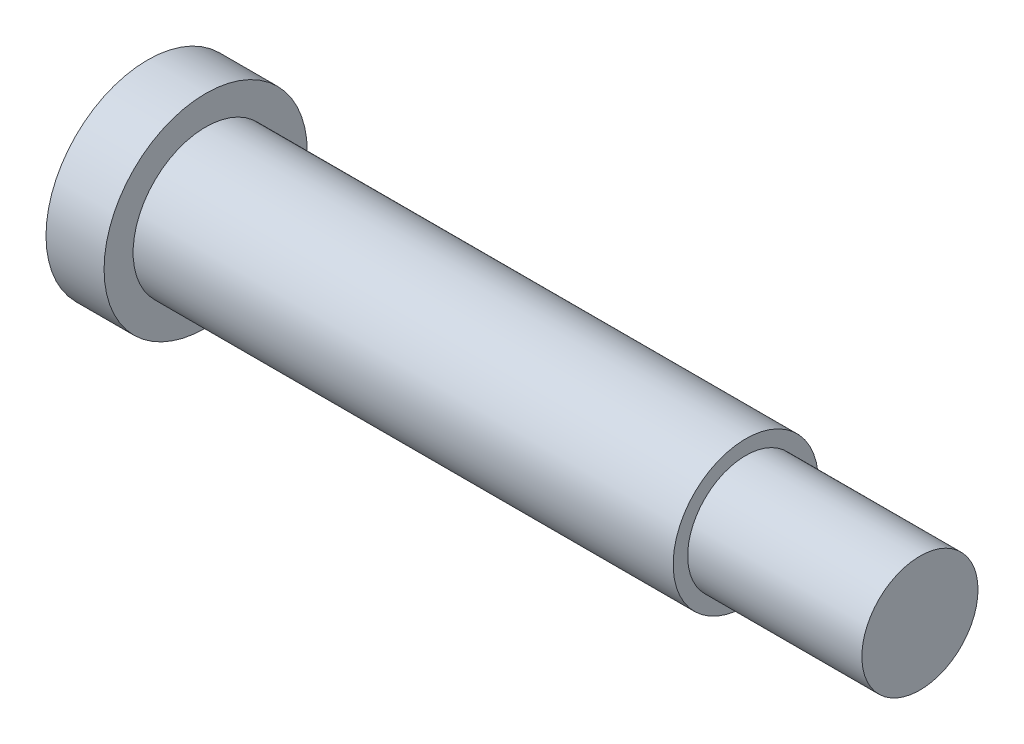
ISO-10303-21;
HEADER;
FILE_DESCRIPTION(('STEP AP214'),'2;1');
FILE_NAME('part.step','',(''),(''),'','','');
FILE_SCHEMA(('AUTOMOTIVE_DESIGN { 1 0 10303 214 1 1 1 1 }'));
ENDSEC;
DATA;
#1=APPLICATION_CONTEXT('core data for automotive mechanical design processes');
#2=APPLICATION_PROTOCOL_DEFINITION('international standard','automotive_design',2000,#1);
#3=PRODUCT_CONTEXT('',#1,'mechanical');
#4=PRODUCT('Part','Part','',(#3));
#5=PRODUCT_RELATED_PRODUCT_CATEGORY('part','',(#4));
#6=PRODUCT_DEFINITION_FORMATION('','',#4);
#7=PRODUCT_DEFINITION_CONTEXT('part definition',#1,'design');
#8=PRODUCT_DEFINITION('design','',#6,#7);
#9=PRODUCT_DEFINITION_SHAPE('','',#8);
#10=(LENGTH_UNIT() NAMED_UNIT(*) SI_UNIT(.MILLI.,.METRE.));
#11=(NAMED_UNIT(*) PLANE_ANGLE_UNIT() SI_UNIT($,.RADIAN.));
#12=(NAMED_UNIT(*) SI_UNIT($,.STERADIAN.) SOLID_ANGLE_UNIT());
#13=UNCERTAINTY_MEASURE_WITH_UNIT(LENGTH_MEASURE(1.E-05),#10,'distance_accuracy_value','');
#14=(GEOMETRIC_REPRESENTATION_CONTEXT(3) GLOBAL_UNCERTAINTY_ASSIGNED_CONTEXT((#13)) GLOBAL_UNIT_ASSIGNED_CONTEXT((#10,
#11,#12)) REPRESENTATION_CONTEXT('',''));
#15=CARTESIAN_POINT('',(0.,0.,0.));
#16=DIRECTION('',(0.,0.,1.));
#17=DIRECTION('',(1.,0.,0.));
#18=AXIS2_PLACEMENT_3D('',#15,#16,#17);
#19=CARTESIAN_POINT('',(3.0049,7.0049,7.0049));
#20=DIRECTION('',(1.,0.,0.));
#21=DIRECTION('',(0.,0.,-1.));
#22=AXIS2_PLACEMENT_3D('',#19,#20,#21);
#23=PLANE('',#22);
#24=DIRECTION('',(0.,1.,0.));
#25=VECTOR('',#24,1.);
#26=CARTESIAN_POINT('',(3.0049,8.159600538379,9.0049));
#27=LINE('',#26,#25);
#28=CARTESIAN_POINT('',(3.0049,8.15960053837884,9.00489999999991));
#29=VERTEX_POINT('',#28);
#30=CARTESIAN_POINT('',(3.0049,5.850199461621,9.0049));
#31=VERTEX_POINT('',#30);
#32=EDGE_CURVE('E84',#29,#31,#27,.F.);
#33=ORIENTED_EDGE('',*,*,#32,.F.);
#34=DIRECTION('',(0.,0.50000000000019,-0.866025403784329));
#35=VECTOR('',#34,1.);
#36=CARTESIAN_POINT('',(3.0049,9.314301076758,7.0049));
#37=LINE('',#36,#35);
#38=CARTESIAN_POINT('',(3.0049,9.31430107675878,7.00489999999991));
#39=VERTEX_POINT('',#38);
#40=EDGE_CURVE('E134',#39,#29,#37,.F.);
#41=ORIENTED_EDGE('',*,*,#40,.F.);
#42=DIRECTION('',(0.,-0.50000000000019,-0.866025403784329));
#43=VECTOR('',#42,1.);
#44=CARTESIAN_POINT('',(3.0049,8.159600538379,5.0049));
#45=LINE('',#44,#43);
#46=CARTESIAN_POINT('',(3.0049,8.159600538379,5.0049));
#47=VERTEX_POINT('',#46);
#48=EDGE_CURVE('E128',#47,#39,#45,.F.);
#49=ORIENTED_EDGE('',*,*,#48,.F.);
#50=DIRECTION('',(0.,-1.,0.));
#51=VECTOR('',#50,1.);
#52=CARTESIAN_POINT('',(3.0049,5.850199461621,5.0049));
#53=LINE('',#52,#51);
#54=CARTESIAN_POINT('',(3.0049,5.85019946162094,5.00489999999996));
#55=VERTEX_POINT('',#54);
#56=EDGE_CURVE('E73',#55,#47,#53,.F.);
#57=ORIENTED_EDGE('',*,*,#56,.F.);
#58=DIRECTION('',(0.,-0.50000000000019,0.866025403784329));
#59=VECTOR('',#58,1.);
#60=CARTESIAN_POINT('',(3.0049,4.695498923241,7.0049));
#61=LINE('',#60,#59);
#62=CARTESIAN_POINT('',(3.0049,4.69549892324103,7.00489999999998));
#63=VERTEX_POINT('',#62);
#64=EDGE_CURVE('E70',#63,#55,#61,.F.);
#65=ORIENTED_EDGE('',*,*,#64,.F.);
#66=DIRECTION('',(0.,0.50000000000019,0.866025403784329));
#67=VECTOR('',#66,1.);
#68=CARTESIAN_POINT('',(3.0049,5.850199461621,9.0049));
#69=LINE('',#68,#67);
#70=EDGE_CURVE('E67',#31,#63,#69,.F.);
#71=ORIENTED_EDGE('',*,*,#70,.F.);
#72=EDGE_LOOP('',(#33,#41,#49,#57,#65,#71));
#73=FACE_BOUND('',#72,.T.);
#74=ADVANCED_FACE('F16',(#73),#23,.F.);
#75=CARTESIAN_POINT('',(0.004899999999992,4.695498923241,7.0049));
#76=DIRECTION('',(0.,0.866025403784329,0.50000000000019));
#77=DIRECTION('',(0.,-0.50000000000019,0.866025403784329));
#78=AXIS2_PLACEMENT_3D('',#75,#76,#77);
#79=PLANE('',#78);
#80=DIRECTION('',(1.,0.,0.));
#81=VECTOR('',#80,1.);
#82=CARTESIAN_POINT('',(0.004899999999992,5.850199461621,5.0049));
#83=LINE('',#82,#81);
#84=CARTESIAN_POINT('',(0.0049000000000025,5.85019946162094,5.00489999999996));
#85=VERTEX_POINT('',#84);
#86=EDGE_CURVE('E124',#85,#55,#83,.T.);
#87=ORIENTED_EDGE('',*,*,#86,.F.);
#88=DIRECTION('',(0.,-0.500000000000243,0.866025403784298));
#89=VECTOR('',#88,1.);
#90=CARTESIAN_POINT('',(0.004899999999992,5.850199461621,5.0049));
#91=LINE('',#90,#89);
#92=CARTESIAN_POINT('',(0.0049000000000025,4.69549892324103,7.00489999999998));
#93=VERTEX_POINT('',#92);
#94=EDGE_CURVE('E81',#85,#93,#91,.T.);
#95=ORIENTED_EDGE('',*,*,#94,.T.);
#96=DIRECTION('',(1.,0.,0.));
#97=VECTOR('',#96,1.);
#98=CARTESIAN_POINT('',(0.004899999999992,4.69549892324112,7.00489999999993));
#99=LINE('',#98,#97);
#100=EDGE_CURVE('E78',#63,#93,#99,.F.);
#101=ORIENTED_EDGE('',*,*,#100,.F.);
#102=ORIENTED_EDGE('',*,*,#64,.T.);
#103=EDGE_LOOP('',(#87,#95,#101,#102));
#104=FACE_BOUND('',#103,.T.);
#105=ADVANCED_FACE('F79',(#104),#79,.T.);
#106=CARTESIAN_POINT('',(0.004899999999992,5.850199461621,9.0049));
#107=DIRECTION('',(0.,0.866025403784329,-0.50000000000019));
#108=DIRECTION('',(0.,0.50000000000019,0.866025403784329));
#109=AXIS2_PLACEMENT_3D('',#106,#107,#108);
#110=PLANE('',#109);
#111=ORIENTED_EDGE('',*,*,#100,.T.);
#112=DIRECTION('',(0.,0.500000000000243,0.866025403784298));
#113=VECTOR('',#112,1.);
#114=CARTESIAN_POINT('',(0.004899999999992,4.695498923241,7.0049));
#115=LINE('',#114,#113);
#116=CARTESIAN_POINT('',(0.0049000000000025,5.850199461621,9.0049));
#117=VERTEX_POINT('',#116);
#118=EDGE_CURVE('E118',#93,#117,#115,.T.);
#119=ORIENTED_EDGE('',*,*,#118,.T.);
#120=DIRECTION('',(1.,0.,0.));
#121=VECTOR('',#120,1.);
#122=CARTESIAN_POINT('',(0.004899999999992,5.850199461621,9.0049));
#123=LINE('',#122,#121);
#124=EDGE_CURVE('E88',#31,#117,#123,.F.);
#125=ORIENTED_EDGE('',*,*,#124,.F.);
#126=ORIENTED_EDGE('',*,*,#70,.T.);
#127=EDGE_LOOP('',(#111,#119,#125,#126));
#128=FACE_BOUND('',#127,.T.);
#129=ADVANCED_FACE('F86',(#128),#110,.T.);
#130=CARTESIAN_POINT('',(0.004899999999992,8.159600538379,9.0049));
#131=DIRECTION('',(0.,0.,-1.));
#132=DIRECTION('',(0.,1.,0.));
#133=AXIS2_PLACEMENT_3D('',#130,#131,#132);
#134=PLANE('',#133);
#135=ORIENTED_EDGE('',*,*,#124,.T.);
#136=DIRECTION('',(0.,1.,0.));
#137=VECTOR('',#136,1.);
#138=CARTESIAN_POINT('',(0.004899999999992,7.0049,9.0049));
#139=LINE('',#138,#137);
#140=CARTESIAN_POINT('',(0.0049000000000025,8.15960053837884,9.00489999999991));
#141=VERTEX_POINT('',#140);
#142=EDGE_CURVE('E116',#117,#141,#139,.T.);
#143=ORIENTED_EDGE('',*,*,#142,.T.);
#144=DIRECTION('',(1.,0.,0.));
#145=VECTOR('',#144,1.);
#146=CARTESIAN_POINT('',(0.004899999999992,8.15960053837837,9.00489999999964));
#147=LINE('',#146,#145);
#148=EDGE_CURVE('E131',#29,#141,#147,.F.);
#149=ORIENTED_EDGE('',*,*,#148,.F.);
#150=ORIENTED_EDGE('',*,*,#32,.T.);
#151=EDGE_LOOP('',(#135,#143,#149,#150));
#152=FACE_BOUND('',#151,.T.);
#153=ADVANCED_FACE('F139',(#152),#134,.T.);
#154=CARTESIAN_POINT('',(0.004899999999992,9.314301076758,7.0049));
#155=DIRECTION('',(0.,-0.866025403784329,-0.50000000000019));
#156=DIRECTION('',(0.,0.50000000000019,-0.866025403784329));
#157=AXIS2_PLACEMENT_3D('',#154,#155,#156);
#158=PLANE('',#157);
#159=ORIENTED_EDGE('',*,*,#148,.T.);
#160=DIRECTION('',(0.,0.500000000000243,-0.866025403784298));
#161=VECTOR('',#160,1.);
#162=CARTESIAN_POINT('',(0.004899999999992,8.159600538379,9.0049));
#163=LINE('',#162,#161);
#164=CARTESIAN_POINT('',(0.0049000000000025,9.31430107675859,7.0048999999998));
#165=VERTEX_POINT('',#164);
#166=EDGE_CURVE('E112',#141,#165,#163,.T.);
#167=ORIENTED_EDGE('',*,*,#166,.T.);
#168=DIRECTION('',(1.,0.,0.));
#169=VECTOR('',#168,1.);
#170=CARTESIAN_POINT('',(0.004899999999992,9.31430107675888,7.00490000000007));
#171=LINE('',#170,#169);
#172=EDGE_CURVE('E126',#39,#165,#171,.F.);
#173=ORIENTED_EDGE('',*,*,#172,.F.);
#174=ORIENTED_EDGE('',*,*,#40,.T.);
#175=EDGE_LOOP('',(#159,#167,#173,#174));
#176=FACE_BOUND('',#175,.T.);
#177=ADVANCED_FACE('F143',(#176),#158,.T.);
#178=CARTESIAN_POINT('',(0.004899999999992,8.159600538379,5.0049));
#179=DIRECTION('',(0.,-0.866025403784329,0.50000000000019));
#180=DIRECTION('',(0.,-0.50000000000019,-0.866025403784329));
#181=AXIS2_PLACEMENT_3D('',#178,#179,#180);
#182=PLANE('',#181);
#183=ORIENTED_EDGE('',*,*,#172,.T.);
#184=DIRECTION('',(0.,-0.500000000000243,-0.866025403784298));
#185=VECTOR('',#184,1.);
#186=CARTESIAN_POINT('',(0.004899999999992,9.314301076759,7.0049));
#187=LINE('',#186,#185);
#188=CARTESIAN_POINT('',(0.0049000000000025,8.159600538379,5.0049));
#189=VERTEX_POINT('',#188);
#190=EDGE_CURVE('E34',#165,#189,#187,.T.);
#191=ORIENTED_EDGE('',*,*,#190,.T.);
#192=DIRECTION('',(1.,0.,0.));
#193=VECTOR('',#192,1.);
#194=CARTESIAN_POINT('',(0.004899999999992,8.159600538379,5.0049));
#195=LINE('',#194,#193);
#196=EDGE_CURVE('E121',#47,#189,#195,.F.);
#197=ORIENTED_EDGE('',*,*,#196,.F.);
#198=ORIENTED_EDGE('',*,*,#48,.T.);
#199=EDGE_LOOP('',(#183,#191,#197,#198));
#200=FACE_BOUND('',#199,.T.);
#201=ADVANCED_FACE('F145',(#200),#182,.T.);
#202=CARTESIAN_POINT('',(0.004899999999992,5.850199461621,5.0049));
#203=DIRECTION('',(0.,0.,1.));
#204=DIRECTION('',(0.,-1.,0.));
#205=AXIS2_PLACEMENT_3D('',#202,#203,#204);
#206=PLANE('',#205);
#207=ORIENTED_EDGE('',*,*,#196,.T.);
#208=DIRECTION('',(0.,1.,0.));
#209=VECTOR('',#208,1.);
#210=CARTESIAN_POINT('',(0.004899999999992,7.0049,5.0049));
#211=LINE('',#210,#209);
#212=EDGE_CURVE('E105',#189,#85,#211,.F.);
#213=ORIENTED_EDGE('',*,*,#212,.T.);
#214=ORIENTED_EDGE('',*,*,#86,.T.);
#215=ORIENTED_EDGE('',*,*,#56,.T.);
#216=EDGE_LOOP('',(#207,#213,#214,#215));
#217=FACE_BOUND('',#216,.T.);
#218=ADVANCED_FACE('F146',(#217),#206,.T.);
#219=CARTESIAN_POINT('',(53.2049,7.0049,7.0049));
#220=DIRECTION('',(1.,0.,0.));
#221=DIRECTION('',(0.,0.,-1.));
#222=AXIS2_PLACEMENT_3D('',#219,#220,#221);
#223=PLANE('',#222);
#224=CARTESIAN_POINT('',(53.2049,7.0049,7.0049));
#225=DIRECTION('',(1.,0.,0.));
#226=DIRECTION('',(0.,0.,-1.));
#227=AXIS2_PLACEMENT_3D('',#224,#225,#226);
#228=CIRCLE('',#227,4.);
#229=CARTESIAN_POINT('',(53.2049,7.0049,3.0049));
#230=VERTEX_POINT('',#229);
#231=EDGE_CURVE('E19',#230,#230,#228,.F.);
#232=ORIENTED_EDGE('',*,*,#231,.F.);
#233=EDGE_LOOP('',(#232));
#234=FACE_BOUND('',#233,.T.);
#235=ADVANCED_FACE('F148',(#234),#223,.T.);
#236=CARTESIAN_POINT('',(0.004899999999992,7.0049,7.0049));
#237=DIRECTION('',(1.,0.,0.));
#238=DIRECTION('',(0.,0.,-1.));
#239=AXIS2_PLACEMENT_3D('',#236,#237,#238);
#240=PLANE('',#239);
#241=ORIENTED_EDGE('',*,*,#190,.F.);
#242=ORIENTED_EDGE('',*,*,#166,.F.);
#243=ORIENTED_EDGE('',*,*,#142,.F.);
#244=ORIENTED_EDGE('',*,*,#118,.F.);
#245=ORIENTED_EDGE('',*,*,#94,.F.);
#246=ORIENTED_EDGE('',*,*,#212,.F.);
#247=EDGE_LOOP('',(#241,#242,#243,#244,#245,#246));
#248=FACE_BOUND('',#247,.T.);
#249=CARTESIAN_POINT('',(0.004900000000006,7.0049,7.0049));
#250=DIRECTION('',(1.,0.,0.));
#251=DIRECTION('',(0.,0.,-1.));
#252=AXIS2_PLACEMENT_3D('',#249,#250,#251);
#253=CIRCLE('',#252,7.);
#254=CARTESIAN_POINT('',(0.004900000000006,7.0049,0.00490000000000039));
#255=VERTEX_POINT('',#254);
#256=EDGE_CURVE('E100',#255,#255,#253,.T.);
#257=ORIENTED_EDGE('',*,*,#256,.F.);
#258=EDGE_LOOP('',(#257));
#259=FACE_BOUND('',#258,.T.);
#260=ADVANCED_FACE('F155',(#248,#259),#240,.F.);
#261=CARTESIAN_POINT('',(41.2049,7.0049,7.0049));
#262=DIRECTION('',(1.,0.,0.));
#263=DIRECTION('',(0.,0.,-1.));
#264=AXIS2_PLACEMENT_3D('',#261,#262,#263);
#265=CYLINDRICAL_SURFACE('',#264,4.);
#266=CARTESIAN_POINT('',(41.2049,7.0049,7.0049));
#267=DIRECTION('',(1.,0.,0.));
#268=DIRECTION('',(0.,0.,-1.));
#269=AXIS2_PLACEMENT_3D('',#266,#267,#268);
#270=CIRCLE('',#269,4.);
#271=CARTESIAN_POINT('',(41.2049,7.0049,3.0049));
#272=VERTEX_POINT('',#271);
#273=EDGE_CURVE('E98',#272,#272,#270,.F.);
#274=ORIENTED_EDGE('',*,*,#273,.F.);
#275=EDGE_LOOP('',(#274));
#276=FACE_BOUND('',#275,.T.);
#277=ORIENTED_EDGE('',*,*,#231,.T.);
#278=EDGE_LOOP('',(#277));
#279=FACE_BOUND('',#278,.T.);
#280=ADVANCED_FACE('F178',(#276,#279),#265,.T.);
#281=CARTESIAN_POINT('',(0.004899999999992,7.0049,7.0049));
#282=DIRECTION('',(1.,0.,0.));
#283=DIRECTION('',(0.,0.,-1.));
#284=AXIS2_PLACEMENT_3D('',#281,#282,#283);
#285=CYLINDRICAL_SURFACE('',#284,7.);
#286=ORIENTED_EDGE('',*,*,#256,.T.);
#287=EDGE_LOOP('',(#286));
#288=FACE_BOUND('',#287,.T.);
#289=CARTESIAN_POINT('',(4.0049,7.0049,7.0049));
#290=DIRECTION('',(1.,0.,0.));
#291=DIRECTION('',(0.,0.,-1.));
#292=AXIS2_PLACEMENT_3D('',#289,#290,#291);
#293=CIRCLE('',#292,7.);
#294=CARTESIAN_POINT('',(4.0049,7.0049,0.00490000000000039));
#295=VERTEX_POINT('',#294);
#296=EDGE_CURVE('E95',#295,#295,#293,.T.);
#297=ORIENTED_EDGE('',*,*,#296,.F.);
#298=EDGE_LOOP('',(#297));
#299=FACE_BOUND('',#298,.T.);
#300=ADVANCED_FACE('F174',(#288,#299),#285,.T.);
#301=CARTESIAN_POINT('',(41.2049,7.0049,7.0049));
#302=DIRECTION('',(1.,0.,0.));
#303=DIRECTION('',(0.,0.,-1.));
#304=AXIS2_PLACEMENT_3D('',#301,#302,#303);
#305=PLANE('',#304);
#306=ORIENTED_EDGE('',*,*,#273,.T.);
#307=EDGE_LOOP('',(#306));
#308=FACE_BOUND('',#307,.T.);
#309=CARTESIAN_POINT('',(41.2049,7.0049,7.0049));
#310=DIRECTION('',(1.,0.,0.));
#311=DIRECTION('',(0.,0.,-1.));
#312=AXIS2_PLACEMENT_3D('',#309,#310,#311);
#313=CIRCLE('',#312,5.);
#314=CARTESIAN_POINT('',(41.2049,7.0049,2.0049));
#315=VERTEX_POINT('',#314);
#316=EDGE_CURVE('E25',#315,#315,#313,.F.);
#317=ORIENTED_EDGE('',*,*,#316,.F.);
#318=EDGE_LOOP('',(#317));
#319=FACE_BOUND('',#318,.T.);
#320=ADVANCED_FACE('F167',(#308,#319),#305,.T.);
#321=CARTESIAN_POINT('',(4.0049,7.0049,7.0049));
#322=DIRECTION('',(1.,0.,0.));
#323=DIRECTION('',(0.,0.,-1.));
#324=AXIS2_PLACEMENT_3D('',#321,#322,#323);
#325=PLANE('',#324);
#326=CARTESIAN_POINT('',(4.0049,7.0049,7.0049));
#327=DIRECTION('',(1.,0.,0.));
#328=DIRECTION('',(0.,0.,-1.));
#329=AXIS2_PLACEMENT_3D('',#326,#327,#328);
#330=CIRCLE('',#329,5.);
#331=CARTESIAN_POINT('',(4.0049,7.0049,2.0049));
#332=VERTEX_POINT('',#331);
#333=EDGE_CURVE('E11',#332,#332,#330,.T.);
#334=ORIENTED_EDGE('',*,*,#333,.F.);
#335=EDGE_LOOP('',(#334));
#336=FACE_BOUND('',#335,.T.);
#337=ORIENTED_EDGE('',*,*,#296,.T.);
#338=EDGE_LOOP('',(#337));
#339=FACE_BOUND('',#338,.T.);
#340=ADVANCED_FACE('F161',(#336,#339),#325,.T.);
#341=CARTESIAN_POINT('',(4.0049,7.0049,7.0049));
#342=DIRECTION('',(1.,0.,0.));
#343=DIRECTION('',(0.,0.,-1.));
#344=AXIS2_PLACEMENT_3D('',#341,#342,#343);
#345=CYLINDRICAL_SURFACE('',#344,5.);
#346=ORIENTED_EDGE('',*,*,#333,.T.);
#347=EDGE_LOOP('',(#346));
#348=FACE_BOUND('',#347,.T.);
#349=ORIENTED_EDGE('',*,*,#316,.T.);
#350=EDGE_LOOP('',(#349));
#351=FACE_BOUND('',#350,.T.);
#352=ADVANCED_FACE('F159',(#348,#351),#345,.T.);
#353=CLOSED_SHELL('',(#74,#105,#129,#153,#177,#201,#218,#235,#260,#280,#300,#320,#340,#352));
#354=MANIFOLD_SOLID_BREP('B1',#353);
#355=ADVANCED_BREP_SHAPE_REPRESENTATION('',(#18,#354),#14);
#356=SHAPE_DEFINITION_REPRESENTATION(#9,#355);
ENDSEC;
END-ISO-10303-21;
